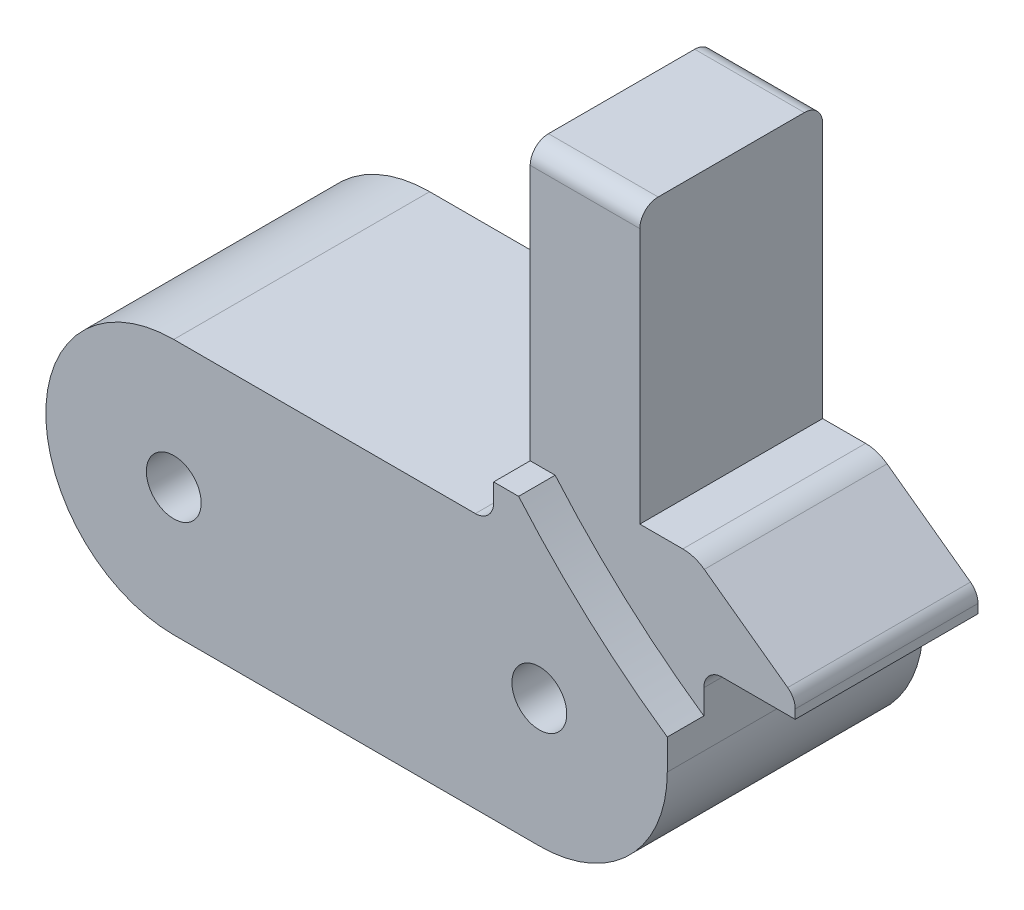
ISO-10303-21;
HEADER;
FILE_DESCRIPTION(('STEP AP214'),'2;1');
FILE_NAME('part.step','',(''),(''),'','','');
FILE_SCHEMA(('AUTOMOTIVE_DESIGN { 1 0 10303 214 1 1 1 1 }'));
ENDSEC;
DATA;
#1=APPLICATION_CONTEXT('core data for automotive mechanical design processes');
#2=APPLICATION_PROTOCOL_DEFINITION('international standard','automotive_design',2000,#1);
#3=PRODUCT_CONTEXT('',#1,'mechanical');
#4=PRODUCT('Part','Part','',(#3));
#5=PRODUCT_RELATED_PRODUCT_CATEGORY('part','',(#4));
#6=PRODUCT_DEFINITION_FORMATION('','',#4);
#7=PRODUCT_DEFINITION_CONTEXT('part definition',#1,'design');
#8=PRODUCT_DEFINITION('design','',#6,#7);
#9=PRODUCT_DEFINITION_SHAPE('','',#8);
#10=(LENGTH_UNIT() NAMED_UNIT(*) SI_UNIT(.MILLI.,.METRE.));
#11=(NAMED_UNIT(*) PLANE_ANGLE_UNIT() SI_UNIT($,.RADIAN.));
#12=(NAMED_UNIT(*) SI_UNIT($,.STERADIAN.) SOLID_ANGLE_UNIT());
#13=UNCERTAINTY_MEASURE_WITH_UNIT(LENGTH_MEASURE(1.E-05),#10,'distance_accuracy_value','');
#14=(GEOMETRIC_REPRESENTATION_CONTEXT(3) GLOBAL_UNCERTAINTY_ASSIGNED_CONTEXT((#13)) GLOBAL_UNIT_ASSIGNED_CONTEXT((#10,
#11,#12)) REPRESENTATION_CONTEXT('',''));
#15=CARTESIAN_POINT('',(0.,0.,0.));
#16=DIRECTION('',(0.,0.,1.));
#17=DIRECTION('',(1.,0.,0.));
#18=AXIS2_PLACEMENT_3D('',#15,#16,#17);
#19=CARTESIAN_POINT('',(0.,4.,14.));
#20=DIRECTION('',(0.,1.,0.));
#21=DIRECTION('',(0.,0.,1.));
#22=AXIS2_PLACEMENT_3D('',#19,#20,#21);
#23=PLANE('',#22);
#24=DIRECTION('',(-1.,0.,0.));
#25=VECTOR('',#24,1.);
#26=CARTESIAN_POINT('',(0.,4.,2.));
#27=LINE('',#26,#25);
#28=CARTESIAN_POINT('',(12.,4.,2.));
#29=VERTEX_POINT('',#28);
#30=CARTESIAN_POINT('',(8.,4.,2.));
#31=VERTEX_POINT('',#30);
#32=EDGE_CURVE('E495',#29,#31,#27,.T.);
#33=ORIENTED_EDGE('',*,*,#32,.F.);
#34=DIRECTION('',(0.,0.,-1.));
#35=VECTOR('',#34,1.);
#36=CARTESIAN_POINT('',(12.,4.,14.));
#37=LINE('',#36,#35);
#38=CARTESIAN_POINT('',(12.,4.,12.));
#39=VERTEX_POINT('',#38);
#40=EDGE_CURVE('E227',#39,#29,#37,.T.);
#41=ORIENTED_EDGE('',*,*,#40,.F.);
#42=DIRECTION('',(1.,0.,0.));
#43=VECTOR('',#42,1.);
#44=CARTESIAN_POINT('',(0.,4.,12.));
#45=LINE('',#44,#43);
#46=CARTESIAN_POINT('',(8.,4.,12.));
#47=VERTEX_POINT('',#46);
#48=EDGE_CURVE('E469',#47,#39,#45,.T.);
#49=ORIENTED_EDGE('',*,*,#48,.F.);
#50=DIRECTION('',(0.,0.,-1.));
#51=VECTOR('',#50,1.);
#52=CARTESIAN_POINT('',(8.,4.,0.));
#53=LINE('',#52,#51);
#54=EDGE_CURVE('E242',#47,#31,#53,.T.);
#55=ORIENTED_EDGE('',*,*,#54,.T.);
#56=EDGE_LOOP('',(#33,#41,#49,#55));
#57=FACE_BOUND('',#56,.T.);
#58=ADVANCED_FACE('F38',(#57),#23,.F.);
#59=CARTESIAN_POINT('',(12.,0.,14.));
#60=DIRECTION('',(-1.,0.,0.));
#61=DIRECTION('',(0.,0.,1.));
#62=AXIS2_PLACEMENT_3D('',#59,#60,#61);
#63=PLANE('',#62);
#64=DIRECTION('',(0.,-1.,0.));
#65=VECTOR('',#64,1.);
#66=CARTESIAN_POINT('',(12.,0.,2.));
#67=LINE('',#66,#65);
#68=CARTESIAN_POINT('',(12.,4.49077540829678,2.));
#69=VERTEX_POINT('',#68);
#70=EDGE_CURVE('E493',#69,#29,#67,.T.);
#71=ORIENTED_EDGE('',*,*,#70,.F.);
#72=DIRECTION('',(0.,0.,-1.));
#73=VECTOR('',#72,1.);
#74=CARTESIAN_POINT('',(12.,4.49077540829678,14.));
#75=LINE('',#74,#73);
#76=CARTESIAN_POINT('',(12.,4.49077540829678,12.));
#77=VERTEX_POINT('',#76);
#78=EDGE_CURVE('E61',#69,#77,#75,.F.);
#79=ORIENTED_EDGE('',*,*,#78,.T.);
#80=DIRECTION('',(0.,1.,0.));
#81=VECTOR('',#80,1.);
#82=CARTESIAN_POINT('',(12.,0.,12.));
#83=LINE('',#82,#81);
#84=EDGE_CURVE('E462',#39,#77,#83,.T.);
#85=ORIENTED_EDGE('',*,*,#84,.F.);
#86=ORIENTED_EDGE('',*,*,#40,.T.);
#87=EDGE_LOOP('',(#71,#79,#85,#86));
#88=FACE_BOUND('',#87,.T.);
#89=ADVANCED_FACE('F419',(#88),#63,.F.);
#90=CARTESIAN_POINT('',(6.52972972972973,8.97837837837838,14.));
#91=DIRECTION('',(0.588171697675046,0.808736084303189,0.));
#92=DIRECTION('',(-0.808736084303189,0.588171697675046,0.));
#93=AXIS2_PLACEMENT_3D('',#90,#91,#92);
#94=PLANE('',#93);
#95=DIRECTION('',(0.,0.,-1.));
#96=VECTOR('',#95,1.);
#97=CARTESIAN_POINT('',(11.588171697675,5.29951149259996,0.));
#98=LINE('',#97,#96);
#99=CARTESIAN_POINT('',(11.588171697675,5.29951149259997,12.));
#100=VERTEX_POINT('',#99);
#101=CARTESIAN_POINT('',(11.588171697675,5.29951149259997,2.));
#102=VERTEX_POINT('',#101);
#103=EDGE_CURVE('E259',#100,#102,#98,.T.);
#104=ORIENTED_EDGE('',*,*,#103,.T.);
#105=DIRECTION('',(-0.808736084303189,0.588171697675046,0.));
#106=VECTOR('',#105,1.);
#107=CARTESIAN_POINT('',(6.52972972972973,8.97837837837838,2.));
#108=LINE('',#107,#106);
#109=CARTESIAN_POINT('',(7.02597576816623,8.61747216860638,2.));
#110=VERTEX_POINT('',#109);
#111=EDGE_CURVE('E489',#102,#110,#108,.T.);
#112=ORIENTED_EDGE('',*,*,#111,.T.);
#113=DIRECTION('',(0.,0.,-1.));
#114=VECTOR('',#113,1.);
#115=CARTESIAN_POINT('',(7.02597576816623,8.61747216860638,14.));
#116=LINE('',#115,#114);
#117=CARTESIAN_POINT('',(7.02597576816623,8.61747216860638,12.));
#118=VERTEX_POINT('',#117);
#119=EDGE_CURVE('E257',#110,#118,#116,.F.);
#120=ORIENTED_EDGE('',*,*,#119,.T.);
#121=DIRECTION('',(0.808736084303189,-0.588171697675046,0.));
#122=VECTOR('',#121,1.);
#123=CARTESIAN_POINT('',(6.52972972972973,8.97837837837838,12.));
#124=LINE('',#123,#122);
#125=EDGE_CURVE('E460',#118,#100,#124,.T.);
#126=ORIENTED_EDGE('',*,*,#125,.T.);
#127=EDGE_LOOP('',(#104,#112,#120,#126));
#128=FACE_BOUND('',#127,.T.);
#129=ADVANCED_FACE('F425',(#128),#94,.T.);
#130=CARTESIAN_POINT('',(0.,9.,14.));
#131=DIRECTION('',(0.,1.,0.));
#132=DIRECTION('',(0.,0.,1.));
#133=AXIS2_PLACEMENT_3D('',#130,#131,#132);
#134=PLANE('',#133);
#135=DIRECTION('',(1.,0.,0.));
#136=VECTOR('',#135,1.);
#137=CARTESIAN_POINT('',(-6.5,9.,2.));
#138=LINE('',#137,#136);
#139=CARTESIAN_POINT('',(-2.5,9.,2.));
#140=VERTEX_POINT('',#139);
#141=CARTESIAN_POINT('',(-1.13433774416142,9.,2.));
#142=VERTEX_POINT('',#141);
#143=EDGE_CURVE('E220',#140,#142,#138,.T.);
#144=ORIENTED_EDGE('',*,*,#143,.T.);
#145=DIRECTION('',(0.,0.,-1.));
#146=VECTOR('',#145,1.);
#147=CARTESIAN_POINT('',(-1.13433774416143,9.,2.));
#148=LINE('',#147,#146);
#149=CARTESIAN_POINT('',(-1.13433774416143,9.,0.));
#150=VERTEX_POINT('',#149);
#151=EDGE_CURVE('E481',#142,#150,#148,.T.);
#152=ORIENTED_EDGE('',*,*,#151,.T.);
#153=DIRECTION('',(1.,0.,0.));
#154=VECTOR('',#153,1.);
#155=CARTESIAN_POINT('',(0.,9.,0.));
#156=LINE('',#155,#154);
#157=CARTESIAN_POINT('',(-2.5,9.,0.));
#158=VERTEX_POINT('',#157);
#159=EDGE_CURVE('E345',#158,#150,#156,.T.);
#160=ORIENTED_EDGE('',*,*,#159,.F.);
#161=DIRECTION('',(0.,0.,1.));
#162=VECTOR('',#161,1.);
#163=CARTESIAN_POINT('',(-2.5,9.,14.));
#164=LINE('',#163,#162);
#165=EDGE_CURVE('E304',#158,#140,#164,.T.);
#166=ORIENTED_EDGE('',*,*,#165,.T.);
#167=EDGE_LOOP('',(#144,#152,#160,#166));
#168=FACE_BOUND('',#167,.T.);
#169=ADVANCED_FACE('F514',(#168),#134,.T.);
#170=DIRECTION('',(0.,0.,-1.));
#171=VECTOR('',#170,1.);
#172=CARTESIAN_POINT('',(5.84963237281614,9.,14.));
#173=LINE('',#172,#171);
#174=CARTESIAN_POINT('',(5.84963237281613,9.,12.));
#175=VERTEX_POINT('',#174);
#176=CARTESIAN_POINT('',(5.84963237281613,9.,2.));
#177=VERTEX_POINT('',#176);
#178=EDGE_CURVE('E208',#175,#177,#173,.T.);
#179=ORIENTED_EDGE('',*,*,#178,.T.);
#180=DIRECTION('',(1.,0.,0.));
#181=VECTOR('',#180,1.);
#182=CARTESIAN_POINT('',(59.5,9.00000000000001,2.));
#183=LINE('',#182,#181);
#184=CARTESIAN_POINT('',(3.5,9.,2.));
#185=VERTEX_POINT('',#184);
#186=EDGE_CURVE('E201',#185,#177,#183,.T.);
#187=ORIENTED_EDGE('',*,*,#186,.F.);
#188=DIRECTION('',(0.,0.,-1.));
#189=VECTOR('',#188,1.);
#190=CARTESIAN_POINT('',(3.5,9.,14.));
#191=LINE('',#190,#189);
#192=CARTESIAN_POINT('',(3.5,9.,12.));
#193=VERTEX_POINT('',#192);
#194=EDGE_CURVE('E206',#193,#185,#191,.T.);
#195=ORIENTED_EDGE('',*,*,#194,.F.);
#196=DIRECTION('',(1.,0.,0.));
#197=VECTOR('',#196,1.);
#198=CARTESIAN_POINT('',(59.5,9.00000000000001,12.));
#199=LINE('',#198,#197);
#200=EDGE_CURVE('E480',#193,#175,#199,.T.);
#201=ORIENTED_EDGE('',*,*,#200,.T.);
#202=EDGE_LOOP('',(#179,#187,#195,#201));
#203=FACE_BOUND('',#202,.T.);
#204=ADVANCED_FACE('F203',(#203),#134,.T.);
#205=CARTESIAN_POINT('',(8.,3.,14.));
#206=DIRECTION('',(0.,0.,1.));
#207=DIRECTION('',(1.,0.,0.));
#208=AXIS2_PLACEMENT_3D('',#205,#206,#207);
#209=CYLINDRICAL_SURFACE('',#208,1.);
#210=CARTESIAN_POINT('',(8.,3.,2.));
#211=DIRECTION('',(0.,0.,-1.));
#212=DIRECTION('',(-1.,0.,0.));
#213=AXIS2_PLACEMENT_3D('',#210,#211,#212);
#214=CIRCLE('',#213,1.);
#215=CARTESIAN_POINT('',(7.,3.,2.));
#216=VERTEX_POINT('',#215);
#217=EDGE_CURVE('E497',#31,#216,#214,.F.);
#218=ORIENTED_EDGE('',*,*,#217,.F.);
#219=ORIENTED_EDGE('',*,*,#54,.F.);
#220=CARTESIAN_POINT('',(8.,3.,12.));
#221=DIRECTION('',(0.,0.,1.));
#222=DIRECTION('',(1.,0.,0.));
#223=AXIS2_PLACEMENT_3D('',#220,#221,#222);
#224=CIRCLE('',#223,1.);
#225=CARTESIAN_POINT('',(7.,3.,12.));
#226=VERTEX_POINT('',#225);
#227=EDGE_CURVE('E474',#226,#47,#224,.F.);
#228=ORIENTED_EDGE('',*,*,#227,.F.);
#229=DIRECTION('',(0.,0.,-1.));
#230=VECTOR('',#229,1.);
#231=CARTESIAN_POINT('',(7.,3.,14.));
#232=LINE('',#231,#230);
#233=EDGE_CURVE('E245',#216,#226,#232,.F.);
#234=ORIENTED_EDGE('',*,*,#233,.F.);
#235=EDGE_LOOP('',(#218,#219,#228,#234));
#236=FACE_BOUND('',#235,.T.);
#237=ADVANCED_FACE('F439',(#236),#209,.F.);
#238=CARTESIAN_POINT('',(5.84963237281614,7.,14.));
#239=DIRECTION('',(0.,0.,-1.));
#240=DIRECTION('',(-1.,0.,0.));
#241=AXIS2_PLACEMENT_3D('',#238,#239,#240);
#242=CYLINDRICAL_SURFACE('',#241,2.);
#243=ORIENTED_EDGE('',*,*,#119,.F.);
#244=CARTESIAN_POINT('',(5.84963237281614,7.,2.));
#245=DIRECTION('',(0.,0.,-1.));
#246=DIRECTION('',(-1.,0.,0.));
#247=AXIS2_PLACEMENT_3D('',#244,#245,#246);
#248=CIRCLE('',#247,2.);
#249=EDGE_CURVE('E487',#110,#177,#248,.F.);
#250=ORIENTED_EDGE('',*,*,#249,.T.);
#251=ORIENTED_EDGE('',*,*,#178,.F.);
#252=CARTESIAN_POINT('',(5.84963237281614,7.,12.));
#253=DIRECTION('',(0.,0.,1.));
#254=DIRECTION('',(1.,0.,0.));
#255=AXIS2_PLACEMENT_3D('',#252,#253,#254);
#256=CIRCLE('',#255,2.);
#257=EDGE_CURVE('E471',#175,#118,#256,.F.);
#258=ORIENTED_EDGE('',*,*,#257,.T.);
#259=EDGE_LOOP('',(#243,#250,#251,#258));
#260=FACE_BOUND('',#259,.T.);
#261=ADVANCED_FACE('F442',(#260),#242,.T.);
#262=CARTESIAN_POINT('',(11.,4.49077540829678,14.));
#263=DIRECTION('',(0.,0.,1.));
#264=DIRECTION('',(1.,0.,0.));
#265=AXIS2_PLACEMENT_3D('',#262,#263,#264);
#266=CYLINDRICAL_SURFACE('',#265,1.);
#267=ORIENTED_EDGE('',*,*,#78,.F.);
#268=CARTESIAN_POINT('',(11.,4.49077540829678,2.));
#269=DIRECTION('',(0.,0.,-1.));
#270=DIRECTION('',(-1.,0.,0.));
#271=AXIS2_PLACEMENT_3D('',#268,#269,#270);
#272=CIRCLE('',#271,1.);
#273=EDGE_CURVE('E456',#69,#102,#272,.F.);
#274=ORIENTED_EDGE('',*,*,#273,.T.);
#275=ORIENTED_EDGE('',*,*,#103,.F.);
#276=CARTESIAN_POINT('',(11.,4.49077540829678,12.));
#277=DIRECTION('',(0.,0.,1.));
#278=DIRECTION('',(1.,0.,0.));
#279=AXIS2_PLACEMENT_3D('',#276,#277,#278);
#280=CIRCLE('',#279,1.);
#281=EDGE_CURVE('E457',#100,#77,#280,.F.);
#282=ORIENTED_EDGE('',*,*,#281,.T.);
#283=EDGE_LOOP('',(#267,#274,#275,#282));
#284=FACE_BOUND('',#283,.T.);
#285=ADVANCED_FACE('F433',(#284),#266,.T.);
#286=CARTESIAN_POINT('',(7.,0.,14.));
#287=DIRECTION('',(-1.,0.,0.));
#288=DIRECTION('',(0.,0.,1.));
#289=AXIS2_PLACEMENT_3D('',#286,#287,#288);
#290=PLANE('',#289);
#291=DIRECTION('',(0.,-1.,0.));
#292=VECTOR('',#291,1.);
#293=CARTESIAN_POINT('',(7.,0.,2.));
#294=LINE('',#293,#292);
#295=CARTESIAN_POINT('',(7.,1.66234303183078,2.));
#296=VERTEX_POINT('',#295);
#297=EDGE_CURVE('E499',#216,#296,#294,.T.);
#298=ORIENTED_EDGE('',*,*,#297,.F.);
#299=ORIENTED_EDGE('',*,*,#233,.T.);
#300=DIRECTION('',(0.,1.,0.));
#301=VECTOR('',#300,1.);
#302=CARTESIAN_POINT('',(7.,0.,12.));
#303=LINE('',#302,#301);
#304=CARTESIAN_POINT('',(7.,1.66234303183078,12.));
#305=VERTEX_POINT('',#304);
#306=EDGE_CURVE('E476',#305,#226,#303,.T.);
#307=ORIENTED_EDGE('',*,*,#306,.F.);
#308=DIRECTION('',(0.,0.,1.));
#309=VECTOR('',#308,1.);
#310=CARTESIAN_POINT('',(7.,1.66234303183078,12.));
#311=LINE('',#310,#309);
#312=CARTESIAN_POINT('',(7.,1.66234303183078,14.));
#313=VERTEX_POINT('',#312);
#314=EDGE_CURVE('E297',#305,#313,#311,.T.);
#315=ORIENTED_EDGE('',*,*,#314,.T.);
#316=DIRECTION('',(0.,1.,0.));
#317=VECTOR('',#316,1.);
#318=CARTESIAN_POINT('',(7.,0.,14.));
#319=LINE('',#318,#317);
#320=CARTESIAN_POINT('',(7.,0.,14.));
#321=VERTEX_POINT('',#320);
#322=EDGE_CURVE('E318',#321,#313,#319,.T.);
#323=ORIENTED_EDGE('',*,*,#322,.F.);
#324=DIRECTION('',(0.,0.,-1.));
#325=VECTOR('',#324,1.);
#326=CARTESIAN_POINT('',(7.,0.,14.));
#327=LINE('',#326,#325);
#328=CARTESIAN_POINT('',(7.,0.,0.));
#329=VERTEX_POINT('',#328);
#330=EDGE_CURVE('E231',#321,#329,#327,.T.);
#331=ORIENTED_EDGE('',*,*,#330,.T.);
#332=DIRECTION('',(0.,1.,0.));
#333=VECTOR('',#332,1.);
#334=CARTESIAN_POINT('',(7.,0.,0.));
#335=LINE('',#334,#333);
#336=CARTESIAN_POINT('',(7.,1.66234303183078,0.));
#337=VERTEX_POINT('',#336);
#338=EDGE_CURVE('E342',#329,#337,#335,.T.);
#339=ORIENTED_EDGE('',*,*,#338,.T.);
#340=DIRECTION('',(0.,0.,-1.));
#341=VECTOR('',#340,1.);
#342=CARTESIAN_POINT('',(7.,1.66234303183078,2.));
#343=LINE('',#342,#341);
#344=EDGE_CURVE('E53',#296,#337,#343,.T.);
#345=ORIENTED_EDGE('',*,*,#344,.F.);
#346=EDGE_LOOP('',(#298,#299,#307,#315,#323,#331,#339,#345));
#347=FACE_BOUND('',#346,.T.);
#348=ADVANCED_FACE('F430',(#347),#290,.F.);
#349=CARTESIAN_POINT('',(0.,0.,0.));
#350=DIRECTION('',(0.,0.,1.));
#351=DIRECTION('',(1.,0.,0.));
#352=AXIS2_PLACEMENT_3D('',#349,#350,#351);
#353=PLANE('',#352);
#354=CARTESIAN_POINT('',(0.,0.,0.));
#355=DIRECTION('',(0.,0.,1.));
#356=DIRECTION('',(1.,0.,0.));
#357=AXIS2_PLACEMENT_3D('',#354,#355,#356);
#358=CIRCLE('',#357,1.5);
#359=CARTESIAN_POINT('',(1.5,0.,0.));
#360=VERTEX_POINT('',#359);
#361=EDGE_CURVE('E316',#360,#360,#358,.T.);
#362=ORIENTED_EDGE('',*,*,#361,.T.);
#363=EDGE_LOOP('',(#362));
#364=FACE_BOUND('',#363,.T.);
#365=CARTESIAN_POINT('',(-20.,0.,0.));
#366=DIRECTION('',(0.,0.,1.));
#367=DIRECTION('',(1.,0.,0.));
#368=AXIS2_PLACEMENT_3D('',#365,#366,#367);
#369=CIRCLE('',#368,1.5);
#370=CARTESIAN_POINT('',(-18.5,0.,0.));
#371=VERTEX_POINT('',#370);
#372=EDGE_CURVE('E356',#371,#371,#369,.T.);
#373=ORIENTED_EDGE('',*,*,#372,.T.);
#374=EDGE_LOOP('',(#373));
#375=FACE_BOUND('',#374,.T.);
#376=CARTESIAN_POINT('',(31.5,37.,0.));
#377=DIRECTION('',(0.,0.,1.));
#378=DIRECTION('',(1.,0.,0.));
#379=AXIS2_PLACEMENT_3D('',#376,#377,#378);
#380=CIRCLE('',#379,43.);
#381=EDGE_CURVE('E211',#150,#337,#380,.T.);
#382=ORIENTED_EDGE('',*,*,#381,.T.);
#383=ORIENTED_EDGE('',*,*,#338,.F.);
#384=CARTESIAN_POINT('',(0.,0.,0.));
#385=DIRECTION('',(0.,0.,1.));
#386=DIRECTION('',(1.,0.,0.));
#387=AXIS2_PLACEMENT_3D('',#384,#385,#386);
#388=CIRCLE('',#387,7.);
#389=CARTESIAN_POINT('',(0.,-7.,0.));
#390=VERTEX_POINT('',#389);
#391=EDGE_CURVE('E340',#390,#329,#388,.T.);
#392=ORIENTED_EDGE('',*,*,#391,.F.);
#393=DIRECTION('',(1.,0.,0.));
#394=VECTOR('',#393,1.);
#395=CARTESIAN_POINT('',(0.,-7.,0.));
#396=LINE('',#395,#394);
#397=CARTESIAN_POINT('',(-20.,-7.,0.));
#398=VERTEX_POINT('',#397);
#399=EDGE_CURVE('E311',#398,#390,#396,.T.);
#400=ORIENTED_EDGE('',*,*,#399,.F.);
#401=CARTESIAN_POINT('',(-20.,0.,0.));
#402=DIRECTION('',(0.,0.,1.));
#403=DIRECTION('',(1.,0.,0.));
#404=AXIS2_PLACEMENT_3D('',#401,#402,#403);
#405=CIRCLE('',#404,7.);
#406=CARTESIAN_POINT('',(-20.,7.,0.));
#407=VERTEX_POINT('',#406);
#408=EDGE_CURVE('E354',#407,#398,#405,.T.);
#409=ORIENTED_EDGE('',*,*,#408,.F.);
#410=DIRECTION('',(1.,0.,0.));
#411=VECTOR('',#410,1.);
#412=CARTESIAN_POINT('',(0.,7.,0.));
#413=LINE('',#412,#411);
#414=CARTESIAN_POINT('',(-3.5,7.,0.));
#415=VERTEX_POINT('',#414);
#416=EDGE_CURVE('E351',#407,#415,#413,.T.);
#417=ORIENTED_EDGE('',*,*,#416,.T.);
#418=CARTESIAN_POINT('',(-3.5,8.,0.));
#419=DIRECTION('',(0.,0.,1.));
#420=DIRECTION('',(1.,0.,0.));
#421=AXIS2_PLACEMENT_3D('',#418,#419,#420);
#422=CIRCLE('',#421,1.);
#423=CARTESIAN_POINT('',(-2.5,8.,0.));
#424=VERTEX_POINT('',#423);
#425=EDGE_CURVE('E252',#415,#424,#422,.T.);
#426=ORIENTED_EDGE('',*,*,#425,.T.);
#427=DIRECTION('',(0.,1.,0.));
#428=VECTOR('',#427,1.);
#429=CARTESIAN_POINT('',(-2.5,0.,0.));
#430=LINE('',#429,#428);
#431=EDGE_CURVE('E348',#424,#158,#430,.T.);
#432=ORIENTED_EDGE('',*,*,#431,.T.);
#433=ORIENTED_EDGE('',*,*,#159,.T.);
#434=EDGE_LOOP('',(#382,#383,#392,#400,#409,#417,#426,#432,#433));
#435=FACE_BOUND('',#434,.T.);
#436=ADVANCED_FACE('F371',(#364,#375,#435),#353,.F.);
#437=CARTESIAN_POINT('',(0.,-7.,14.));
#438=DIRECTION('',(0.,1.,0.));
#439=DIRECTION('',(0.,0.,1.));
#440=AXIS2_PLACEMENT_3D('',#437,#438,#439);
#441=PLANE('',#440);
#442=ORIENTED_EDGE('',*,*,#399,.T.);
#443=DIRECTION('',(0.,0.,-1.));
#444=VECTOR('',#443,1.);
#445=CARTESIAN_POINT('',(0.,-7.,14.));
#446=LINE('',#445,#444);
#447=CARTESIAN_POINT('',(0.,-7.,14.));
#448=VERTEX_POINT('',#447);
#449=EDGE_CURVE('E239',#448,#390,#446,.T.);
#450=ORIENTED_EDGE('',*,*,#449,.F.);
#451=DIRECTION('',(1.,0.,0.));
#452=VECTOR('',#451,1.);
#453=CARTESIAN_POINT('',(0.,-7.,14.));
#454=LINE('',#453,#452);
#455=CARTESIAN_POINT('',(-20.,-7.,14.));
#456=VERTEX_POINT('',#455);
#457=EDGE_CURVE('E312',#456,#448,#454,.T.);
#458=ORIENTED_EDGE('',*,*,#457,.F.);
#459=DIRECTION('',(0.,0.,-1.));
#460=VECTOR('',#459,1.);
#461=CARTESIAN_POINT('',(-20.,-7.,14.));
#462=LINE('',#461,#460);
#463=EDGE_CURVE('E233',#456,#398,#462,.T.);
#464=ORIENTED_EDGE('',*,*,#463,.T.);
#465=EDGE_LOOP('',(#442,#450,#458,#464));
#466=FACE_BOUND('',#465,.T.);
#467=ADVANCED_FACE('F365',(#466),#441,.F.);
#468=CARTESIAN_POINT('',(0.,0.,14.));
#469=DIRECTION('',(0.,0.,-1.));
#470=DIRECTION('',(-1.,0.,0.));
#471=AXIS2_PLACEMENT_3D('',#468,#469,#470);
#472=CYLINDRICAL_SURFACE('',#471,7.);
#473=ORIENTED_EDGE('',*,*,#391,.T.);
#474=ORIENTED_EDGE('',*,*,#330,.F.);
#475=CARTESIAN_POINT('',(0.,0.,14.));
#476=DIRECTION('',(0.,0.,1.));
#477=DIRECTION('',(1.,0.,0.));
#478=AXIS2_PLACEMENT_3D('',#475,#476,#477);
#479=CIRCLE('',#478,7.);
#480=EDGE_CURVE('E315',#448,#321,#479,.T.);
#481=ORIENTED_EDGE('',*,*,#480,.F.);
#482=ORIENTED_EDGE('',*,*,#449,.T.);
#483=EDGE_LOOP('',(#473,#474,#481,#482));
#484=FACE_BOUND('',#483,.T.);
#485=ADVANCED_FACE('F376',(#484),#472,.T.);
#486=DIRECTION('',(0.,0.,1.));
#487=VECTOR('',#486,1.);
#488=CARTESIAN_POINT('',(-1.13433774416143,9.,12.));
#489=LINE('',#488,#487);
#490=CARTESIAN_POINT('',(-1.13433774416142,9.,12.));
#491=VERTEX_POINT('',#490);
#492=CARTESIAN_POINT('',(-1.13433774416143,9.,14.));
#493=VERTEX_POINT('',#492);
#494=EDGE_CURVE('E400',#491,#493,#489,.T.);
#495=ORIENTED_EDGE('',*,*,#494,.F.);
#496=DIRECTION('',(1.,0.,0.));
#497=VECTOR('',#496,1.);
#498=CARTESIAN_POINT('',(-6.5,9.,12.));
#499=LINE('',#498,#497);
#500=CARTESIAN_POINT('',(-2.5,9.,12.));
#501=VERTEX_POINT('',#500);
#502=EDGE_CURVE('E301',#501,#491,#499,.T.);
#503=ORIENTED_EDGE('',*,*,#502,.F.);
#504=DIRECTION('',(0.,0.,1.));
#505=VECTOR('',#504,1.);
#506=CARTESIAN_POINT('',(-2.5,9.,14.));
#507=LINE('',#506,#505);
#508=CARTESIAN_POINT('',(-2.5,9.,14.));
#509=VERTEX_POINT('',#508);
#510=EDGE_CURVE('E308',#501,#509,#507,.T.);
#511=ORIENTED_EDGE('',*,*,#510,.T.);
#512=DIRECTION('',(1.,0.,0.));
#513=VECTOR('',#512,1.);
#514=CARTESIAN_POINT('',(0.,9.,14.));
#515=LINE('',#514,#513);
#516=EDGE_CURVE('E321',#509,#493,#515,.T.);
#517=ORIENTED_EDGE('',*,*,#516,.T.);
#518=EDGE_LOOP('',(#495,#503,#511,#517));
#519=FACE_BOUND('',#518,.T.);
#520=ADVANCED_FACE('F399',(#519),#134,.T.);
#521=CARTESIAN_POINT('',(3.5,0.,14.));
#522=DIRECTION('',(1.,0.,0.));
#523=DIRECTION('',(0.,1.,0.));
#524=AXIS2_PLACEMENT_3D('',#521,#522,#523);
#525=PLANE('',#524);
#526=DIRECTION('',(0.,-1.,0.));
#527=VECTOR('',#526,1.);
#528=CARTESIAN_POINT('',(3.5,9.,2.));
#529=LINE('',#528,#527);
#530=CARTESIAN_POINT('',(3.5,23.,2.));
#531=VERTEX_POINT('',#530);
#532=EDGE_CURVE('E215',#531,#185,#529,.T.);
#533=ORIENTED_EDGE('',*,*,#532,.F.);
#534=CARTESIAN_POINT('',(3.5,23.,3.));
#535=DIRECTION('',(1.,0.,0.));
#536=DIRECTION('',(0.,1.,0.));
#537=AXIS2_PLACEMENT_3D('',#534,#535,#536);
#538=CIRCLE('',#537,1.);
#539=CARTESIAN_POINT('',(3.5,24.,3.));
#540=VERTEX_POINT('',#539);
#541=EDGE_CURVE('E273',#531,#540,#538,.T.);
#542=ORIENTED_EDGE('',*,*,#541,.T.);
#543=DIRECTION('',(0.,0.,-1.));
#544=VECTOR('',#543,1.);
#545=CARTESIAN_POINT('',(3.5,24.,12.));
#546=LINE('',#545,#544);
#547=CARTESIAN_POINT('',(3.5,24.,11.));
#548=VERTEX_POINT('',#547);
#549=EDGE_CURVE('E221',#548,#540,#546,.T.);
#550=ORIENTED_EDGE('',*,*,#549,.F.);
#551=CARTESIAN_POINT('',(3.5,23.,11.));
#552=DIRECTION('',(1.,0.,0.));
#553=DIRECTION('',(0.,1.,0.));
#554=AXIS2_PLACEMENT_3D('',#551,#552,#553);
#555=CIRCLE('',#554,1.);
#556=CARTESIAN_POINT('',(3.5,23.,12.));
#557=VERTEX_POINT('',#556);
#558=EDGE_CURVE('E271',#548,#557,#555,.T.);
#559=ORIENTED_EDGE('',*,*,#558,.T.);
#560=DIRECTION('',(0.,1.,0.));
#561=VECTOR('',#560,1.);
#562=CARTESIAN_POINT('',(3.5,9.,12.));
#563=LINE('',#562,#561);
#564=EDGE_CURVE('E226',#193,#557,#563,.T.);
#565=ORIENTED_EDGE('',*,*,#564,.F.);
#566=ORIENTED_EDGE('',*,*,#194,.T.);
#567=EDGE_LOOP('',(#533,#542,#550,#559,#565,#566));
#568=FACE_BOUND('',#567,.T.);
#569=ADVANCED_FACE('F224',(#568),#525,.T.);
#570=CARTESIAN_POINT('',(-2.5,0.,14.));
#571=DIRECTION('',(-1.,0.,0.));
#572=DIRECTION('',(0.,-1.,0.));
#573=AXIS2_PLACEMENT_3D('',#570,#571,#572);
#574=PLANE('',#573);
#575=DIRECTION('',(0.,0.,1.));
#576=VECTOR('',#575,1.);
#577=CARTESIAN_POINT('',(-2.5,24.,14.));
#578=LINE('',#577,#576);
#579=CARTESIAN_POINT('',(-2.5,24.,3.));
#580=VERTEX_POINT('',#579);
#581=CARTESIAN_POINT('',(-2.5,24.,11.));
#582=VERTEX_POINT('',#581);
#583=EDGE_CURVE('E263',#580,#582,#578,.T.);
#584=ORIENTED_EDGE('',*,*,#583,.F.);
#585=CARTESIAN_POINT('',(-2.5,23.,3.));
#586=DIRECTION('',(-1.,0.,0.));
#587=DIRECTION('',(0.,-1.,0.));
#588=AXIS2_PLACEMENT_3D('',#585,#586,#587);
#589=CIRCLE('',#588,1.);
#590=CARTESIAN_POINT('',(-2.5,23.,2.));
#591=VERTEX_POINT('',#590);
#592=EDGE_CURVE('E46',#580,#591,#589,.T.);
#593=ORIENTED_EDGE('',*,*,#592,.T.);
#594=DIRECTION('',(0.,1.,0.));
#595=VECTOR('',#594,1.);
#596=CARTESIAN_POINT('',(-2.5,0.,2.));
#597=LINE('',#596,#595);
#598=EDGE_CURVE('E266',#140,#591,#597,.T.);
#599=ORIENTED_EDGE('',*,*,#598,.F.);
#600=ORIENTED_EDGE('',*,*,#165,.F.);
#601=ORIENTED_EDGE('',*,*,#431,.F.);
#602=DIRECTION('',(0.,0.,-1.));
#603=VECTOR('',#602,1.);
#604=CARTESIAN_POINT('',(-2.5,8.,14.));
#605=LINE('',#604,#603);
#606=CARTESIAN_POINT('',(-2.5,8.,14.));
#607=VERTEX_POINT('',#606);
#608=EDGE_CURVE('E250',#424,#607,#605,.F.);
#609=ORIENTED_EDGE('',*,*,#608,.T.);
#610=DIRECTION('',(0.,1.,0.));
#611=VECTOR('',#610,1.);
#612=CARTESIAN_POINT('',(-2.5,0.,14.));
#613=LINE('',#612,#611);
#614=EDGE_CURVE('E324',#607,#509,#613,.T.);
#615=ORIENTED_EDGE('',*,*,#614,.T.);
#616=ORIENTED_EDGE('',*,*,#510,.F.);
#617=DIRECTION('',(0.,-1.,0.));
#618=VECTOR('',#617,1.);
#619=CARTESIAN_POINT('',(-2.5,0.,12.));
#620=LINE('',#619,#618);
#621=CARTESIAN_POINT('',(-2.5,23.,12.));
#622=VERTEX_POINT('',#621);
#623=EDGE_CURVE('E268',#622,#501,#620,.T.);
#624=ORIENTED_EDGE('',*,*,#623,.F.);
#625=CARTESIAN_POINT('',(-2.5,23.,11.));
#626=DIRECTION('',(-1.,0.,0.));
#627=DIRECTION('',(0.,-1.,0.));
#628=AXIS2_PLACEMENT_3D('',#625,#626,#627);
#629=CIRCLE('',#628,1.);
#630=EDGE_CURVE('E280',#622,#582,#629,.T.);
#631=ORIENTED_EDGE('',*,*,#630,.T.);
#632=EDGE_LOOP('',(#584,#593,#599,#600,#601,#609,#615,#616,#624,#631));
#633=FACE_BOUND('',#632,.T.);
#634=ADVANCED_FACE('F286',(#633),#574,.T.);
#635=CARTESIAN_POINT('',(0.,7.,14.));
#636=DIRECTION('',(0.,1.,0.));
#637=DIRECTION('',(0.,0.,1.));
#638=AXIS2_PLACEMENT_3D('',#635,#636,#637);
#639=PLANE('',#638);
#640=DIRECTION('',(1.,0.,0.));
#641=VECTOR('',#640,1.);
#642=CARTESIAN_POINT('',(0.,7.,14.));
#643=LINE('',#642,#641);
#644=CARTESIAN_POINT('',(-20.,7.,14.));
#645=VERTEX_POINT('',#644);
#646=CARTESIAN_POINT('',(-3.5,7.,14.));
#647=VERTEX_POINT('',#646);
#648=EDGE_CURVE('E327',#645,#647,#643,.T.);
#649=ORIENTED_EDGE('',*,*,#648,.T.);
#650=DIRECTION('',(0.,0.,-1.));
#651=VECTOR('',#650,1.);
#652=CARTESIAN_POINT('',(-3.5,7.,0.));
#653=LINE('',#652,#651);
#654=EDGE_CURVE('E247',#647,#415,#653,.T.);
#655=ORIENTED_EDGE('',*,*,#654,.T.);
#656=ORIENTED_EDGE('',*,*,#416,.F.);
#657=DIRECTION('',(0.,0.,-1.));
#658=VECTOR('',#657,1.);
#659=CARTESIAN_POINT('',(-20.,7.,14.));
#660=LINE('',#659,#658);
#661=EDGE_CURVE('E228',#645,#407,#660,.T.);
#662=ORIENTED_EDGE('',*,*,#661,.F.);
#663=EDGE_LOOP('',(#649,#655,#656,#662));
#664=FACE_BOUND('',#663,.T.);
#665=ADVANCED_FACE('F385',(#664),#639,.T.);
#666=CARTESIAN_POINT('',(-20.,0.,14.));
#667=DIRECTION('',(0.,0.,-1.));
#668=DIRECTION('',(-1.,0.,0.));
#669=AXIS2_PLACEMENT_3D('',#666,#667,#668);
#670=CYLINDRICAL_SURFACE('',#669,1.5);
#671=CARTESIAN_POINT('',(-20.,0.,14.));
#672=DIRECTION('',(0.,0.,1.));
#673=DIRECTION('',(1.,0.,0.));
#674=AXIS2_PLACEMENT_3D('',#671,#672,#673);
#675=CIRCLE('',#674,1.5);
#676=CARTESIAN_POINT('',(-18.5,0.,14.));
#677=VERTEX_POINT('',#676);
#678=EDGE_CURVE('E332',#677,#677,#675,.T.);
#679=ORIENTED_EDGE('',*,*,#678,.T.);
#680=EDGE_LOOP('',(#679));
#681=FACE_BOUND('',#680,.T.);
#682=ORIENTED_EDGE('',*,*,#372,.F.);
#683=EDGE_LOOP('',(#682));
#684=FACE_BOUND('',#683,.T.);
#685=ADVANCED_FACE('F528',(#681,#684),#670,.F.);
#686=CARTESIAN_POINT('',(-20.,0.,14.));
#687=DIRECTION('',(0.,0.,-1.));
#688=DIRECTION('',(-1.,0.,0.));
#689=AXIS2_PLACEMENT_3D('',#686,#687,#688);
#690=CYLINDRICAL_SURFACE('',#689,7.);
#691=ORIENTED_EDGE('',*,*,#408,.T.);
#692=ORIENTED_EDGE('',*,*,#463,.F.);
#693=CARTESIAN_POINT('',(-20.,0.,14.));
#694=DIRECTION('',(0.,0.,1.));
#695=DIRECTION('',(1.,0.,0.));
#696=AXIS2_PLACEMENT_3D('',#693,#694,#695);
#697=CIRCLE('',#696,7.);
#698=EDGE_CURVE('E330',#645,#456,#697,.T.);
#699=ORIENTED_EDGE('',*,*,#698,.F.);
#700=ORIENTED_EDGE('',*,*,#661,.T.);
#701=EDGE_LOOP('',(#691,#692,#699,#700));
#702=FACE_BOUND('',#701,.T.);
#703=ADVANCED_FACE('F383',(#702),#690,.T.);
#704=CARTESIAN_POINT('',(0.,0.,14.));
#705=DIRECTION('',(0.,0.,-1.));
#706=DIRECTION('',(-1.,0.,0.));
#707=AXIS2_PLACEMENT_3D('',#704,#705,#706);
#708=CYLINDRICAL_SURFACE('',#707,1.5);
#709=CARTESIAN_POINT('',(0.,0.,14.));
#710=DIRECTION('',(0.,0.,1.));
#711=DIRECTION('',(1.,0.,0.));
#712=AXIS2_PLACEMENT_3D('',#709,#710,#711);
#713=CIRCLE('',#712,1.5);
#714=CARTESIAN_POINT('',(1.5,0.,14.));
#715=VERTEX_POINT('',#714);
#716=EDGE_CURVE('E335',#715,#715,#713,.T.);
#717=ORIENTED_EDGE('',*,*,#716,.T.);
#718=EDGE_LOOP('',(#717));
#719=FACE_BOUND('',#718,.T.);
#720=ORIENTED_EDGE('',*,*,#361,.F.);
#721=EDGE_LOOP('',(#720));
#722=FACE_BOUND('',#721,.T.);
#723=ADVANCED_FACE('F531',(#719,#722),#708,.F.);
#724=CARTESIAN_POINT('',(0.,0.,14.));
#725=DIRECTION('',(0.,0.,1.));
#726=DIRECTION('',(1.,0.,0.));
#727=AXIS2_PLACEMENT_3D('',#724,#725,#726);
#728=PLANE('',#727);
#729=CARTESIAN_POINT('',(31.5,37.,14.));
#730=DIRECTION('',(0.,0.,1.));
#731=DIRECTION('',(1.,0.,0.));
#732=AXIS2_PLACEMENT_3D('',#729,#730,#731);
#733=CIRCLE('',#732,43.);
#734=EDGE_CURVE('E464',#493,#313,#733,.T.);
#735=ORIENTED_EDGE('',*,*,#734,.F.);
#736=ORIENTED_EDGE('',*,*,#516,.F.);
#737=ORIENTED_EDGE('',*,*,#614,.F.);
#738=CARTESIAN_POINT('',(-3.5,8.,14.));
#739=DIRECTION('',(0.,0.,1.));
#740=DIRECTION('',(1.,0.,0.));
#741=AXIS2_PLACEMENT_3D('',#738,#739,#740);
#742=CIRCLE('',#741,1.);
#743=EDGE_CURVE('E254',#607,#647,#742,.F.);
#744=ORIENTED_EDGE('',*,*,#743,.T.);
#745=ORIENTED_EDGE('',*,*,#648,.F.);
#746=ORIENTED_EDGE('',*,*,#698,.T.);
#747=ORIENTED_EDGE('',*,*,#457,.T.);
#748=ORIENTED_EDGE('',*,*,#480,.T.);
#749=ORIENTED_EDGE('',*,*,#322,.T.);
#750=EDGE_LOOP('',(#735,#736,#737,#744,#745,#746,#747,#748,#749));
#751=FACE_BOUND('',#750,.T.);
#752=ORIENTED_EDGE('',*,*,#678,.F.);
#753=EDGE_LOOP('',(#752));
#754=FACE_BOUND('',#753,.T.);
#755=ORIENTED_EDGE('',*,*,#716,.F.);
#756=EDGE_LOOP('',(#755));
#757=FACE_BOUND('',#756,.T.);
#758=ADVANCED_FACE('F380',(#751,#754,#757),#728,.T.);
#759=CARTESIAN_POINT('',(-3.5,8.,14.));
#760=DIRECTION('',(0.,0.,1.));
#761=DIRECTION('',(1.,0.,0.));
#762=AXIS2_PLACEMENT_3D('',#759,#760,#761);
#763=CYLINDRICAL_SURFACE('',#762,1.);
#764=ORIENTED_EDGE('',*,*,#743,.F.);
#765=ORIENTED_EDGE('',*,*,#608,.F.);
#766=ORIENTED_EDGE('',*,*,#425,.F.);
#767=ORIENTED_EDGE('',*,*,#654,.F.);
#768=EDGE_LOOP('',(#764,#765,#766,#767));
#769=FACE_BOUND('',#768,.T.);
#770=ADVANCED_FACE('F392',(#769),#763,.F.);
#771=CARTESIAN_POINT('',(-6.5,9.,12.));
#772=DIRECTION('',(0.,0.,-1.));
#773=DIRECTION('',(-1.,0.,0.));
#774=AXIS2_PLACEMENT_3D('',#771,#772,#773);
#775=PLANE('',#774);
#776=ORIENTED_EDGE('',*,*,#502,.T.);
#777=CARTESIAN_POINT('',(31.5,37.,12.));
#778=DIRECTION('',(0.,0.,1.));
#779=DIRECTION('',(1.,0.,0.));
#780=AXIS2_PLACEMENT_3D('',#777,#778,#779);
#781=CIRCLE('',#780,43.);
#782=EDGE_CURVE('E405',#491,#305,#781,.T.);
#783=ORIENTED_EDGE('',*,*,#782,.T.);
#784=ORIENTED_EDGE('',*,*,#306,.T.);
#785=ORIENTED_EDGE('',*,*,#227,.T.);
#786=ORIENTED_EDGE('',*,*,#48,.T.);
#787=ORIENTED_EDGE('',*,*,#84,.T.);
#788=ORIENTED_EDGE('',*,*,#281,.F.);
#789=ORIENTED_EDGE('',*,*,#125,.F.);
#790=ORIENTED_EDGE('',*,*,#257,.F.);
#791=ORIENTED_EDGE('',*,*,#200,.F.);
#792=ORIENTED_EDGE('',*,*,#564,.T.);
#793=DIRECTION('',(1.,0.,0.));
#794=VECTOR('',#793,1.);
#795=CARTESIAN_POINT('',(-6.5,23.,12.));
#796=LINE('',#795,#794);
#797=EDGE_CURVE('E11',#557,#622,#796,.F.);
#798=ORIENTED_EDGE('',*,*,#797,.T.);
#799=ORIENTED_EDGE('',*,*,#623,.T.);
#800=EDGE_LOOP('',(#776,#783,#784,#785,#786,#787,#788,#789,#790,#791,#792,#798,#799));
#801=FACE_BOUND('',#800,.T.);
#802=ADVANCED_FACE('F403',(#801),#775,.F.);
#803=CARTESIAN_POINT('',(-6.5,9.,2.));
#804=DIRECTION('',(0.,0.,1.));
#805=DIRECTION('',(1.,0.,0.));
#806=AXIS2_PLACEMENT_3D('',#803,#804,#805);
#807=PLANE('',#806);
#808=ORIENTED_EDGE('',*,*,#532,.T.);
#809=ORIENTED_EDGE('',*,*,#186,.T.);
#810=ORIENTED_EDGE('',*,*,#249,.F.);
#811=ORIENTED_EDGE('',*,*,#111,.F.);
#812=ORIENTED_EDGE('',*,*,#273,.F.);
#813=ORIENTED_EDGE('',*,*,#70,.T.);
#814=ORIENTED_EDGE('',*,*,#32,.T.);
#815=ORIENTED_EDGE('',*,*,#217,.T.);
#816=ORIENTED_EDGE('',*,*,#297,.T.);
#817=CARTESIAN_POINT('',(31.5,37.,2.));
#818=DIRECTION('',(0.,0.,1.));
#819=DIRECTION('',(1.,0.,0.));
#820=AXIS2_PLACEMENT_3D('',#817,#818,#819);
#821=CIRCLE('',#820,43.);
#822=EDGE_CURVE('E501',#142,#296,#821,.T.);
#823=ORIENTED_EDGE('',*,*,#822,.F.);
#824=ORIENTED_EDGE('',*,*,#143,.F.);
#825=ORIENTED_EDGE('',*,*,#598,.T.);
#826=DIRECTION('',(1.,0.,0.));
#827=VECTOR('',#826,1.);
#828=CARTESIAN_POINT('',(-6.5,23.,2.));
#829=LINE('',#828,#827);
#830=EDGE_CURVE('E218',#591,#531,#829,.T.);
#831=ORIENTED_EDGE('',*,*,#830,.T.);
#832=EDGE_LOOP('',(#808,#809,#810,#811,#812,#813,#814,#815,#816,#823,#824,#825,#831));
#833=FACE_BOUND('',#832,.T.);
#834=ADVANCED_FACE('F216',(#833),#807,.F.);
#835=CARTESIAN_POINT('',(-6.5,24.,12.));
#836=DIRECTION('',(0.,-1.,0.));
#837=DIRECTION('',(1.,0.,0.));
#838=AXIS2_PLACEMENT_3D('',#835,#836,#837);
#839=PLANE('',#838);
#840=ORIENTED_EDGE('',*,*,#549,.T.);
#841=DIRECTION('',(1.,0.,0.));
#842=VECTOR('',#841,1.);
#843=CARTESIAN_POINT('',(-6.5,24.,3.));
#844=LINE('',#843,#842);
#845=EDGE_CURVE('E278',#540,#580,#844,.F.);
#846=ORIENTED_EDGE('',*,*,#845,.T.);
#847=ORIENTED_EDGE('',*,*,#583,.T.);
#848=DIRECTION('',(1.,0.,0.));
#849=VECTOR('',#848,1.);
#850=CARTESIAN_POINT('',(-6.5,24.,11.));
#851=LINE('',#850,#849);
#852=EDGE_CURVE('E275',#582,#548,#851,.T.);
#853=ORIENTED_EDGE('',*,*,#852,.T.);
#854=EDGE_LOOP('',(#840,#846,#847,#853));
#855=FACE_BOUND('',#854,.T.);
#856=ADVANCED_FACE('F294',(#855),#839,.F.);
#857=CARTESIAN_POINT('',(-6.5,23.,3.));
#858=DIRECTION('',(1.,0.,0.));
#859=DIRECTION('',(0.,1.,0.));
#860=AXIS2_PLACEMENT_3D('',#857,#858,#859);
#861=CYLINDRICAL_SURFACE('',#860,1.);
#862=ORIENTED_EDGE('',*,*,#592,.F.);
#863=ORIENTED_EDGE('',*,*,#845,.F.);
#864=ORIENTED_EDGE('',*,*,#541,.F.);
#865=ORIENTED_EDGE('',*,*,#830,.F.);
#866=EDGE_LOOP('',(#862,#863,#864,#865));
#867=FACE_BOUND('',#866,.T.);
#868=ADVANCED_FACE('F290',(#867),#861,.T.);
#869=CARTESIAN_POINT('',(-6.5,23.,11.));
#870=DIRECTION('',(1.,0.,0.));
#871=DIRECTION('',(0.,1.,0.));
#872=AXIS2_PLACEMENT_3D('',#869,#870,#871);
#873=CYLINDRICAL_SURFACE('',#872,1.);
#874=ORIENTED_EDGE('',*,*,#630,.F.);
#875=ORIENTED_EDGE('',*,*,#797,.F.);
#876=ORIENTED_EDGE('',*,*,#558,.F.);
#877=ORIENTED_EDGE('',*,*,#852,.F.);
#878=EDGE_LOOP('',(#874,#875,#876,#877));
#879=FACE_BOUND('',#878,.T.);
#880=ADVANCED_FACE('F40',(#879),#873,.T.);
#881=CARTESIAN_POINT('',(31.5,37.,12.));
#882=DIRECTION('',(0.,0.,1.));
#883=DIRECTION('',(1.,0.,0.));
#884=AXIS2_PLACEMENT_3D('',#881,#882,#883);
#885=CYLINDRICAL_SURFACE('',#884,43.);
#886=ORIENTED_EDGE('',*,*,#782,.F.);
#887=ORIENTED_EDGE('',*,*,#494,.T.);
#888=ORIENTED_EDGE('',*,*,#734,.T.);
#889=ORIENTED_EDGE('',*,*,#314,.F.);
#890=EDGE_LOOP('',(#886,#887,#888,#889));
#891=FACE_BOUND('',#890,.T.);
#892=ADVANCED_FACE('F410',(#891),#885,.F.);
#893=CARTESIAN_POINT('',(31.5,37.,2.));
#894=DIRECTION('',(0.,0.,-1.));
#895=DIRECTION('',(-1.,0.,0.));
#896=AXIS2_PLACEMENT_3D('',#893,#894,#895);
#897=CYLINDRICAL_SURFACE('',#896,43.);
#898=ORIENTED_EDGE('',*,*,#822,.T.);
#899=ORIENTED_EDGE('',*,*,#344,.T.);
#900=ORIENTED_EDGE('',*,*,#381,.F.);
#901=ORIENTED_EDGE('',*,*,#151,.F.);
#902=EDGE_LOOP('',(#898,#899,#900,#901));
#903=FACE_BOUND('',#902,.T.);
#904=ADVANCED_FACE('F415',(#903),#897,.F.);
#905=CLOSED_SHELL('',(#58,#89,#129,#169,#204,#237,#261,#285,#348,#436,#467,#485,#520,#569,#634,
#665,#685,#703,#723,#758,#770,#802,#834,#856,#868,#880,#892,#904));
#906=MANIFOLD_SOLID_BREP('B2',#905);
#907=ADVANCED_BREP_SHAPE_REPRESENTATION('',(#18,#906),#14);
#908=SHAPE_DEFINITION_REPRESENTATION(#9,#907);
ENDSEC;
END-ISO-10303-21;
